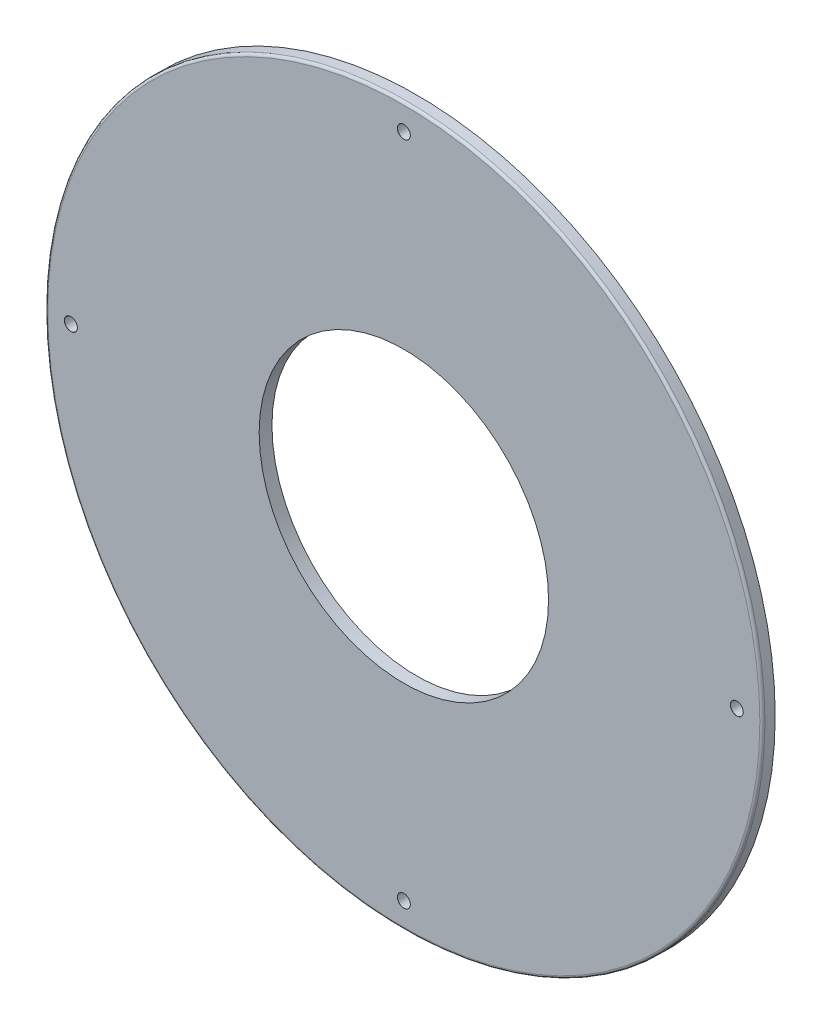
ISO-10303-21;
HEADER;
FILE_DESCRIPTION(('STEP AP214'),'2;1');
FILE_NAME('part.step','',(''),(''),'','','');
FILE_SCHEMA(('AUTOMOTIVE_DESIGN { 1 0 10303 214 1 1 1 1 }'));
ENDSEC;
DATA;
#1=APPLICATION_CONTEXT('core data for automotive mechanical design processes');
#2=APPLICATION_PROTOCOL_DEFINITION('international standard','automotive_design',2000,#1);
#3=PRODUCT_CONTEXT('',#1,'mechanical');
#4=PRODUCT('Part','Part','',(#3));
#5=PRODUCT_RELATED_PRODUCT_CATEGORY('part','',(#4));
#6=PRODUCT_DEFINITION_FORMATION('','',#4);
#7=PRODUCT_DEFINITION_CONTEXT('part definition',#1,'design');
#8=PRODUCT_DEFINITION('design','',#6,#7);
#9=PRODUCT_DEFINITION_SHAPE('','',#8);
#10=(LENGTH_UNIT() NAMED_UNIT(*) SI_UNIT(.MILLI.,.METRE.));
#11=(NAMED_UNIT(*) PLANE_ANGLE_UNIT() SI_UNIT($,.RADIAN.));
#12=(NAMED_UNIT(*) SI_UNIT($,.STERADIAN.) SOLID_ANGLE_UNIT());
#13=UNCERTAINTY_MEASURE_WITH_UNIT(LENGTH_MEASURE(1.E-05),#10,'distance_accuracy_value','');
#14=(GEOMETRIC_REPRESENTATION_CONTEXT(3) GLOBAL_UNCERTAINTY_ASSIGNED_CONTEXT((#13)) GLOBAL_UNIT_ASSIGNED_CONTEXT((#10,
#11,#12)) REPRESENTATION_CONTEXT('',''));
#15=CARTESIAN_POINT('',(0.,0.,0.));
#16=DIRECTION('',(0.,0.,1.));
#17=DIRECTION('',(1.,0.,0.));
#18=AXIS2_PLACEMENT_3D('',#15,#16,#17);
#19=CARTESIAN_POINT('',(0.,0.,5.));
#20=DIRECTION('',(0.,0.,1.));
#21=DIRECTION('',(1.,0.,0.));
#22=AXIS2_PLACEMENT_3D('',#19,#20,#21);
#23=PLANE('',#22);
#24=CARTESIAN_POINT('',(0.,0.,5.));
#25=DIRECTION('',(0.,0.,1.));
#26=DIRECTION('',(1.,0.,0.));
#27=AXIS2_PLACEMENT_3D('',#24,#25,#26);
#28=CIRCLE('',#27,139.);
#29=CARTESIAN_POINT('',(139.,0.,5.));
#30=VERTEX_POINT('',#29);
#31=EDGE_CURVE('E72',#30,#30,#28,.T.);
#32=ORIENTED_EDGE('',*,*,#31,.T.);
#33=EDGE_LOOP('',(#32));
#34=FACE_BOUND('',#33,.T.);
#35=CARTESIAN_POINT('',(0.,130.,5.));
#36=DIRECTION('',(0.,0.,1.));
#37=DIRECTION('',(1.,0.,0.));
#38=AXIS2_PLACEMENT_3D('',#35,#36,#37);
#39=CIRCLE('',#38,2.525);
#40=CARTESIAN_POINT('',(2.525,130.,5.));
#41=VERTEX_POINT('',#40);
#42=EDGE_CURVE('E105',#41,#41,#39,.T.);
#43=ORIENTED_EDGE('',*,*,#42,.F.);
#44=EDGE_LOOP('',(#43));
#45=FACE_BOUND('',#44,.T.);
#46=CARTESIAN_POINT('',(0.,-130.,5.));
#47=DIRECTION('',(0.,0.,1.));
#48=DIRECTION('',(1.,0.,0.));
#49=AXIS2_PLACEMENT_3D('',#46,#47,#48);
#50=CIRCLE('',#49,2.525);
#51=CARTESIAN_POINT('',(2.525,-130.,5.));
#52=VERTEX_POINT('',#51);
#53=EDGE_CURVE('E99',#52,#52,#50,.T.);
#54=ORIENTED_EDGE('',*,*,#53,.F.);
#55=EDGE_LOOP('',(#54));
#56=FACE_BOUND('',#55,.T.);
#57=CARTESIAN_POINT('',(130.,0.,5.));
#58=DIRECTION('',(0.,0.,1.));
#59=DIRECTION('',(1.,0.,0.));
#60=AXIS2_PLACEMENT_3D('',#57,#58,#59);
#61=CIRCLE('',#60,2.525);
#62=CARTESIAN_POINT('',(132.525,0.,5.));
#63=VERTEX_POINT('',#62);
#64=EDGE_CURVE('E93',#63,#63,#61,.T.);
#65=ORIENTED_EDGE('',*,*,#64,.F.);
#66=EDGE_LOOP('',(#65));
#67=FACE_BOUND('',#66,.T.);
#68=CARTESIAN_POINT('',(-130.,0.,5.));
#69=DIRECTION('',(0.,0.,1.));
#70=DIRECTION('',(1.,0.,0.));
#71=AXIS2_PLACEMENT_3D('',#68,#69,#70);
#72=CIRCLE('',#71,2.525);
#73=CARTESIAN_POINT('',(-127.475,0.,5.));
#74=VERTEX_POINT('',#73);
#75=EDGE_CURVE('E87',#74,#74,#72,.T.);
#76=ORIENTED_EDGE('',*,*,#75,.F.);
#77=EDGE_LOOP('',(#76));
#78=FACE_BOUND('',#77,.T.);
#79=CARTESIAN_POINT('',(0.,0.,5.));
#80=DIRECTION('',(0.,0.,1.));
#81=DIRECTION('',(1.,0.,0.));
#82=AXIS2_PLACEMENT_3D('',#79,#80,#81);
#83=CIRCLE('',#82,56.5);
#84=CARTESIAN_POINT('',(56.5,0.,5.));
#85=VERTEX_POINT('',#84);
#86=EDGE_CURVE('E78',#85,#85,#83,.T.);
#87=ORIENTED_EDGE('',*,*,#86,.F.);
#88=EDGE_LOOP('',(#87));
#89=FACE_BOUND('',#88,.T.);
#90=ADVANCED_FACE('F36',(#34,#45,#56,#67,#78,#89),#23,.T.);
#91=CARTESIAN_POINT('',(0.,0.,0.));
#92=DIRECTION('',(0.,0.,1.));
#93=DIRECTION('',(1.,0.,0.));
#94=AXIS2_PLACEMENT_3D('',#91,#92,#93);
#95=PLANE('',#94);
#96=CARTESIAN_POINT('',(130.,0.,0.));
#97=DIRECTION('',(0.,0.,1.));
#98=DIRECTION('',(1.,0.,0.));
#99=AXIS2_PLACEMENT_3D('',#96,#97,#98);
#100=CIRCLE('',#99,3.5);
#101=CARTESIAN_POINT('',(133.5,0.,0.));
#102=VERTEX_POINT('',#101);
#103=EDGE_CURVE('E52',#102,#102,#100,.T.);
#104=ORIENTED_EDGE('',*,*,#103,.T.);
#105=EDGE_LOOP('',(#104));
#106=FACE_BOUND('',#105,.T.);
#107=CARTESIAN_POINT('',(0.,-130.,0.));
#108=DIRECTION('',(0.,0.,1.));
#109=DIRECTION('',(1.,0.,0.));
#110=AXIS2_PLACEMENT_3D('',#107,#108,#109);
#111=CIRCLE('',#110,3.5);
#112=CARTESIAN_POINT('',(3.5,-130.,0.));
#113=VERTEX_POINT('',#112);
#114=EDGE_CURVE('E57',#113,#113,#111,.T.);
#115=ORIENTED_EDGE('',*,*,#114,.T.);
#116=EDGE_LOOP('',(#115));
#117=FACE_BOUND('',#116,.T.);
#118=CARTESIAN_POINT('',(-130.,0.,0.));
#119=DIRECTION('',(0.,0.,1.));
#120=DIRECTION('',(1.,0.,0.));
#121=AXIS2_PLACEMENT_3D('',#118,#119,#120);
#122=CIRCLE('',#121,3.5);
#123=CARTESIAN_POINT('',(-126.5,0.,0.));
#124=VERTEX_POINT('',#123);
#125=EDGE_CURVE('E60',#124,#124,#122,.T.);
#126=ORIENTED_EDGE('',*,*,#125,.T.);
#127=EDGE_LOOP('',(#126));
#128=FACE_BOUND('',#127,.T.);
#129=CARTESIAN_POINT('',(0.,130.,0.));
#130=DIRECTION('',(0.,0.,1.));
#131=DIRECTION('',(1.,0.,0.));
#132=AXIS2_PLACEMENT_3D('',#129,#130,#131);
#133=CIRCLE('',#132,3.5);
#134=CARTESIAN_POINT('',(3.5,130.,0.));
#135=VERTEX_POINT('',#134);
#136=EDGE_CURVE('E63',#135,#135,#133,.T.);
#137=ORIENTED_EDGE('',*,*,#136,.T.);
#138=EDGE_LOOP('',(#137));
#139=FACE_BOUND('',#138,.T.);
#140=CARTESIAN_POINT('',(0.,0.,0.));
#141=DIRECTION('',(0.,0.,1.));
#142=DIRECTION('',(1.,0.,0.));
#143=AXIS2_PLACEMENT_3D('',#140,#141,#142);
#144=CIRCLE('',#143,140.);
#145=CARTESIAN_POINT('',(140.,0.,0.));
#146=VERTEX_POINT('',#145);
#147=EDGE_CURVE('E75',#146,#146,#144,.T.);
#148=ORIENTED_EDGE('',*,*,#147,.F.);
#149=EDGE_LOOP('',(#148));
#150=FACE_BOUND('',#149,.T.);
#151=CARTESIAN_POINT('',(0.,0.,0.));
#152=DIRECTION('',(0.,0.,1.));
#153=DIRECTION('',(1.,0.,0.));
#154=AXIS2_PLACEMENT_3D('',#151,#152,#153);
#155=CIRCLE('',#154,56.5);
#156=CARTESIAN_POINT('',(56.5,0.,0.));
#157=VERTEX_POINT('',#156);
#158=EDGE_CURVE('E79',#157,#157,#155,.T.);
#159=ORIENTED_EDGE('',*,*,#158,.T.);
#160=EDGE_LOOP('',(#159));
#161=FACE_BOUND('',#160,.T.);
#162=ADVANCED_FACE('F113',(#106,#117,#128,#139,#150,#161),#95,.F.);
#163=CARTESIAN_POINT('',(0.,0.,5.));
#164=DIRECTION('',(0.,0.,-1.));
#165=DIRECTION('',(-1.,0.,0.));
#166=AXIS2_PLACEMENT_3D('',#163,#164,#165);
#167=CYLINDRICAL_SURFACE('',#166,140.);
#168=CARTESIAN_POINT('',(0.,0.,4.));
#169=DIRECTION('',(0.,0.,1.));
#170=DIRECTION('',(1.,0.,0.));
#171=AXIS2_PLACEMENT_3D('',#168,#169,#170);
#172=CIRCLE('',#171,140.);
#173=CARTESIAN_POINT('',(140.,0.,4.));
#174=VERTEX_POINT('',#173);
#175=EDGE_CURVE('E69',#174,#174,#172,.F.);
#176=ORIENTED_EDGE('',*,*,#175,.T.);
#177=EDGE_LOOP('',(#176));
#178=FACE_BOUND('',#177,.T.);
#179=ORIENTED_EDGE('',*,*,#147,.T.);
#180=EDGE_LOOP('',(#179));
#181=FACE_BOUND('',#180,.T.);
#182=ADVANCED_FACE('F128',(#178,#181),#167,.T.);
#183=CARTESIAN_POINT('',(0.,0.,5.));
#184=DIRECTION('',(0.,0.,-1.));
#185=DIRECTION('',(-1.,0.,0.));
#186=AXIS2_PLACEMENT_3D('',#183,#184,#185);
#187=CYLINDRICAL_SURFACE('',#186,56.5);
#188=ORIENTED_EDGE('',*,*,#86,.T.);
#189=EDGE_LOOP('',(#188));
#190=FACE_BOUND('',#189,.T.);
#191=ORIENTED_EDGE('',*,*,#158,.F.);
#192=EDGE_LOOP('',(#191));
#193=FACE_BOUND('',#192,.T.);
#194=ADVANCED_FACE('F124',(#190,#193),#187,.F.);
#195=CARTESIAN_POINT('',(-130.,0.,5.));
#196=DIRECTION('',(0.,0.,1.));
#197=DIRECTION('',(1.,0.,0.));
#198=AXIS2_PLACEMENT_3D('',#195,#196,#197);
#199=CYLINDRICAL_SURFACE('',#198,2.5);
#200=CARTESIAN_POINT('',(-130.,0.,1.00000000000001));
#201=DIRECTION('',(0.,0.,1.));
#202=DIRECTION('',(1.,0.,0.));
#203=AXIS2_PLACEMENT_3D('',#200,#201,#202);
#204=CIRCLE('',#203,2.5);
#205=CARTESIAN_POINT('',(-127.5,0.,1.00000000000001));
#206=VERTEX_POINT('',#205);
#207=EDGE_CURVE('E44',#206,#206,#204,.F.);
#208=ORIENTED_EDGE('',*,*,#207,.T.);
#209=EDGE_LOOP('',(#208));
#210=FACE_BOUND('',#209,.T.);
#211=CARTESIAN_POINT('',(-130.,0.,4.975));
#212=DIRECTION('',(0.,0.,1.));
#213=DIRECTION('',(1.,0.,0.));
#214=AXIS2_PLACEMENT_3D('',#211,#212,#213);
#215=CIRCLE('',#214,2.5);
#216=CARTESIAN_POINT('',(-127.5,0.,4.975));
#217=VERTEX_POINT('',#216);
#218=EDGE_CURVE('E82',#217,#217,#215,.T.);
#219=ORIENTED_EDGE('',*,*,#218,.T.);
#220=EDGE_LOOP('',(#219));
#221=FACE_BOUND('',#220,.T.);
#222=ADVANCED_FACE('F127',(#210,#221),#199,.F.);
#223=CARTESIAN_POINT('',(-130.,0.,5.));
#224=DIRECTION('',(0.,0.,1.));
#225=DIRECTION('',(1.,0.,0.));
#226=AXIS2_PLACEMENT_3D('',#223,#224,#225);
#227=CONICAL_SURFACE('',#226,2.525,0.785398163397362);
#228=ORIENTED_EDGE('',*,*,#218,.F.);
#229=EDGE_LOOP('',(#228));
#230=FACE_BOUND('',#229,.T.);
#231=ORIENTED_EDGE('',*,*,#75,.T.);
#232=EDGE_LOOP('',(#231));
#233=FACE_BOUND('',#232,.T.);
#234=ADVANCED_FACE('F227',(#230,#233),#227,.F.);
#235=CARTESIAN_POINT('',(130.,0.,5.));
#236=DIRECTION('',(0.,0.,1.));
#237=DIRECTION('',(1.,0.,0.));
#238=AXIS2_PLACEMENT_3D('',#235,#236,#237);
#239=CYLINDRICAL_SURFACE('',#238,2.5);
#240=CARTESIAN_POINT('',(130.,0.,1.00000000000001));
#241=DIRECTION('',(0.,0.,1.));
#242=DIRECTION('',(1.,0.,0.));
#243=AXIS2_PLACEMENT_3D('',#240,#241,#242);
#244=CIRCLE('',#243,2.5);
#245=CARTESIAN_POINT('',(132.5,0.,1.00000000000001));
#246=VERTEX_POINT('',#245);
#247=EDGE_CURVE('E66',#246,#246,#244,.F.);
#248=ORIENTED_EDGE('',*,*,#247,.T.);
#249=EDGE_LOOP('',(#248));
#250=FACE_BOUND('',#249,.T.);
#251=CARTESIAN_POINT('',(130.,0.,4.975));
#252=DIRECTION('',(0.,0.,1.));
#253=DIRECTION('',(1.,0.,0.));
#254=AXIS2_PLACEMENT_3D('',#251,#252,#253);
#255=CIRCLE('',#254,2.5);
#256=CARTESIAN_POINT('',(132.5,0.,4.975));
#257=VERTEX_POINT('',#256);
#258=EDGE_CURVE('E90',#257,#257,#255,.T.);
#259=ORIENTED_EDGE('',*,*,#258,.T.);
#260=EDGE_LOOP('',(#259));
#261=FACE_BOUND('',#260,.T.);
#262=ADVANCED_FACE('F224',(#250,#261),#239,.F.);
#263=CARTESIAN_POINT('',(130.,0.,5.));
#264=DIRECTION('',(0.,0.,1.));
#265=DIRECTION('',(1.,0.,0.));
#266=AXIS2_PLACEMENT_3D('',#263,#264,#265);
#267=CONICAL_SURFACE('',#266,2.525,0.785398163397362);
#268=ORIENTED_EDGE('',*,*,#258,.F.);
#269=EDGE_LOOP('',(#268));
#270=FACE_BOUND('',#269,.T.);
#271=ORIENTED_EDGE('',*,*,#64,.T.);
#272=EDGE_LOOP('',(#271));
#273=FACE_BOUND('',#272,.T.);
#274=ADVANCED_FACE('F218',(#270,#273),#267,.F.);
#275=CARTESIAN_POINT('',(0.,-130.,5.));
#276=DIRECTION('',(0.,0.,1.));
#277=DIRECTION('',(1.,0.,0.));
#278=AXIS2_PLACEMENT_3D('',#275,#276,#277);
#279=CYLINDRICAL_SURFACE('',#278,2.5);
#280=CARTESIAN_POINT('',(0.,-130.,1.00000000000001));
#281=DIRECTION('',(0.,0.,1.));
#282=DIRECTION('',(1.,0.,0.));
#283=AXIS2_PLACEMENT_3D('',#280,#281,#282);
#284=CIRCLE('',#283,2.5);
#285=CARTESIAN_POINT('',(2.5,-130.,1.00000000000001));
#286=VERTEX_POINT('',#285);
#287=EDGE_CURVE('E48',#286,#286,#284,.F.);
#288=ORIENTED_EDGE('',*,*,#287,.T.);
#289=EDGE_LOOP('',(#288));
#290=FACE_BOUND('',#289,.T.);
#291=CARTESIAN_POINT('',(0.,-130.,4.975));
#292=DIRECTION('',(0.,0.,1.));
#293=DIRECTION('',(1.,0.,0.));
#294=AXIS2_PLACEMENT_3D('',#291,#292,#293);
#295=CIRCLE('',#294,2.5);
#296=CARTESIAN_POINT('',(2.5,-130.,4.975));
#297=VERTEX_POINT('',#296);
#298=EDGE_CURVE('E96',#297,#297,#295,.T.);
#299=ORIENTED_EDGE('',*,*,#298,.T.);
#300=EDGE_LOOP('',(#299));
#301=FACE_BOUND('',#300,.T.);
#302=ADVANCED_FACE('F214',(#290,#301),#279,.F.);
#303=CARTESIAN_POINT('',(0.,-130.,5.));
#304=DIRECTION('',(0.,0.,1.));
#305=DIRECTION('',(1.,0.,0.));
#306=AXIS2_PLACEMENT_3D('',#303,#304,#305);
#307=CONICAL_SURFACE('',#306,2.525,0.785398163397414);
#308=ORIENTED_EDGE('',*,*,#298,.F.);
#309=EDGE_LOOP('',(#308));
#310=FACE_BOUND('',#309,.T.);
#311=ORIENTED_EDGE('',*,*,#53,.T.);
#312=EDGE_LOOP('',(#311));
#313=FACE_BOUND('',#312,.T.);
#314=ADVANCED_FACE('F208',(#310,#313),#307,.F.);
#315=CARTESIAN_POINT('',(0.,130.,5.));
#316=DIRECTION('',(0.,0.,1.));
#317=DIRECTION('',(1.,0.,0.));
#318=AXIS2_PLACEMENT_3D('',#315,#316,#317);
#319=CYLINDRICAL_SURFACE('',#318,2.5);
#320=CARTESIAN_POINT('',(0.,130.,1.00000000000001));
#321=DIRECTION('',(0.,0.,1.));
#322=DIRECTION('',(1.,0.,0.));
#323=AXIS2_PLACEMENT_3D('',#320,#321,#322);
#324=CIRCLE('',#323,2.5);
#325=CARTESIAN_POINT('',(2.5,130.,1.00000000000001));
#326=VERTEX_POINT('',#325);
#327=EDGE_CURVE('E10',#326,#326,#324,.F.);
#328=ORIENTED_EDGE('',*,*,#327,.T.);
#329=EDGE_LOOP('',(#328));
#330=FACE_BOUND('',#329,.T.);
#331=CARTESIAN_POINT('',(0.,130.,4.975));
#332=DIRECTION('',(0.,0.,1.));
#333=DIRECTION('',(1.,0.,0.));
#334=AXIS2_PLACEMENT_3D('',#331,#332,#333);
#335=CIRCLE('',#334,2.5);
#336=CARTESIAN_POINT('',(2.5,130.,4.975));
#337=VERTEX_POINT('',#336);
#338=EDGE_CURVE('E102',#337,#337,#335,.T.);
#339=ORIENTED_EDGE('',*,*,#338,.T.);
#340=EDGE_LOOP('',(#339));
#341=FACE_BOUND('',#340,.T.);
#342=ADVANCED_FACE('F204',(#330,#341),#319,.F.);
#343=CARTESIAN_POINT('',(0.,130.,5.));
#344=DIRECTION('',(0.,0.,1.));
#345=DIRECTION('',(1.,0.,0.));
#346=AXIS2_PLACEMENT_3D('',#343,#344,#345);
#347=CONICAL_SURFACE('',#346,2.525,0.785398163397414);
#348=ORIENTED_EDGE('',*,*,#338,.F.);
#349=EDGE_LOOP('',(#348));
#350=FACE_BOUND('',#349,.T.);
#351=ORIENTED_EDGE('',*,*,#42,.T.);
#352=EDGE_LOOP('',(#351));
#353=FACE_BOUND('',#352,.T.);
#354=ADVANCED_FACE('F109',(#350,#353),#347,.F.);
#355=CARTESIAN_POINT('',(0.,0.,4.));
#356=DIRECTION('',(0.,0.,1.));
#357=DIRECTION('',(1.,0.,0.));
#358=AXIS2_PLACEMENT_3D('',#355,#356,#357);
#359=TOROIDAL_SURFACE('',#358,139.,1.);
#360=ORIENTED_EDGE('',*,*,#175,.F.);
#361=EDGE_LOOP('',(#360));
#362=FACE_BOUND('',#361,.T.);
#363=ORIENTED_EDGE('',*,*,#31,.F.);
#364=EDGE_LOOP('',(#363));
#365=FACE_BOUND('',#364,.T.);
#366=ADVANCED_FACE('F144',(#362,#365),#359,.T.);
#367=CARTESIAN_POINT('',(130.,0.,1.00000000000001));
#368=DIRECTION('',(0.,0.,-1.));
#369=DIRECTION('',(-1.,0.,0.));
#370=AXIS2_PLACEMENT_3D('',#367,#368,#369);
#371=CONICAL_SURFACE('',#370,2.5,0.785398163397444);
#372=ORIENTED_EDGE('',*,*,#103,.F.);
#373=EDGE_LOOP('',(#372));
#374=FACE_BOUND('',#373,.T.);
#375=ORIENTED_EDGE('',*,*,#247,.F.);
#376=EDGE_LOOP('',(#375));
#377=FACE_BOUND('',#376,.T.);
#378=ADVANCED_FACE('F147',(#374,#377),#371,.F.);
#379=CARTESIAN_POINT('',(0.,-130.,1.00000000000001));
#380=DIRECTION('',(0.,0.,-1.));
#381=DIRECTION('',(-1.,0.,0.));
#382=AXIS2_PLACEMENT_3D('',#379,#380,#381);
#383=CONICAL_SURFACE('',#382,2.5,0.785398163397444);
#384=ORIENTED_EDGE('',*,*,#114,.F.);
#385=EDGE_LOOP('',(#384));
#386=FACE_BOUND('',#385,.T.);
#387=ORIENTED_EDGE('',*,*,#287,.F.);
#388=EDGE_LOOP('',(#387));
#389=FACE_BOUND('',#388,.T.);
#390=ADVANCED_FACE('F155',(#386,#389),#383,.F.);
#391=CARTESIAN_POINT('',(-130.,0.,1.00000000000001));
#392=DIRECTION('',(0.,0.,-1.));
#393=DIRECTION('',(-1.,0.,0.));
#394=AXIS2_PLACEMENT_3D('',#391,#392,#393);
#395=CONICAL_SURFACE('',#394,2.5,0.785398163397444);
#396=ORIENTED_EDGE('',*,*,#125,.F.);
#397=EDGE_LOOP('',(#396));
#398=FACE_BOUND('',#397,.T.);
#399=ORIENTED_EDGE('',*,*,#207,.F.);
#400=EDGE_LOOP('',(#399));
#401=FACE_BOUND('',#400,.T.);
#402=ADVANCED_FACE('F161',(#398,#401),#395,.F.);
#403=CARTESIAN_POINT('',(0.,130.,1.00000000000001));
#404=DIRECTION('',(0.,0.,-1.));
#405=DIRECTION('',(-1.,0.,0.));
#406=AXIS2_PLACEMENT_3D('',#403,#404,#405);
#407=CONICAL_SURFACE('',#406,2.5,0.785398163397444);
#408=ORIENTED_EDGE('',*,*,#136,.F.);
#409=EDGE_LOOP('',(#408));
#410=FACE_BOUND('',#409,.T.);
#411=ORIENTED_EDGE('',*,*,#327,.F.);
#412=EDGE_LOOP('',(#411));
#413=FACE_BOUND('',#412,.T.);
#414=ADVANCED_FACE('F39',(#410,#413),#407,.F.);
#415=CLOSED_SHELL('',(#90,#162,#182,#194,#222,#234,#262,#274,#302,#314,#342,#354,#366,#378,#390,
#402,#414));
#416=MANIFOLD_SOLID_BREP('B2',#415);
#417=ADVANCED_BREP_SHAPE_REPRESENTATION('',(#18,#416),#14);
#418=SHAPE_DEFINITION_REPRESENTATION(#9,#417);
ENDSEC;
END-ISO-10303-21;
